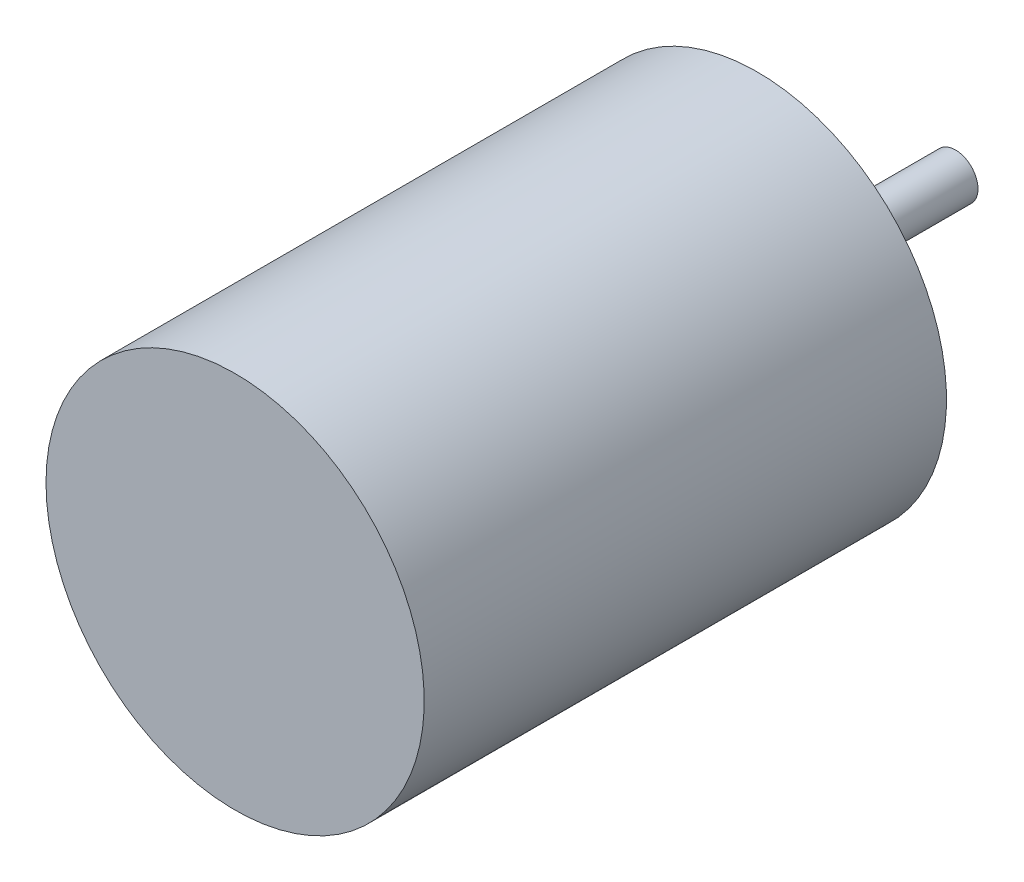
ISO-10303-21;
HEADER;
FILE_DESCRIPTION(('STEP AP214'),'2;1');
FILE_NAME('part.step','',(''),(''),'','','');
FILE_SCHEMA(('AUTOMOTIVE_DESIGN { 1 0 10303 214 1 1 1 1 }'));
ENDSEC;
DATA;
#1=APPLICATION_CONTEXT('core data for automotive mechanical design processes');
#2=APPLICATION_PROTOCOL_DEFINITION('international standard','automotive_design',2000,#1);
#3=PRODUCT_CONTEXT('',#1,'mechanical');
#4=PRODUCT('Part','Part','',(#3));
#5=PRODUCT_RELATED_PRODUCT_CATEGORY('part','',(#4));
#6=PRODUCT_DEFINITION_FORMATION('','',#4);
#7=PRODUCT_DEFINITION_CONTEXT('part definition',#1,'design');
#8=PRODUCT_DEFINITION('design','',#6,#7);
#9=PRODUCT_DEFINITION_SHAPE('','',#8);
#10=(LENGTH_UNIT() NAMED_UNIT(*) SI_UNIT(.MILLI.,.METRE.));
#11=(NAMED_UNIT(*) PLANE_ANGLE_UNIT() SI_UNIT($,.RADIAN.));
#12=(NAMED_UNIT(*) SI_UNIT($,.STERADIAN.) SOLID_ANGLE_UNIT());
#13=UNCERTAINTY_MEASURE_WITH_UNIT(LENGTH_MEASURE(1.E-05),#10,'distance_accuracy_value','');
#14=(GEOMETRIC_REPRESENTATION_CONTEXT(3) GLOBAL_UNCERTAINTY_ASSIGNED_CONTEXT((#13)) GLOBAL_UNIT_ASSIGNED_CONTEXT((#10,
#11,#12)) REPRESENTATION_CONTEXT('',''));
#15=CARTESIAN_POINT('',(0.,0.,0.));
#16=DIRECTION('',(0.,0.,1.));
#17=DIRECTION('',(1.,0.,0.));
#18=AXIS2_PLACEMENT_3D('',#15,#16,#17);
#19=CARTESIAN_POINT('',(75.7710063810863,-68.5826651294381,0.));
#20=DIRECTION('',(0.,0.,1.));
#21=DIRECTION('',(1.,0.,0.));
#22=AXIS2_PLACEMENT_3D('',#19,#20,#21);
#23=PLANE('',#22);
#24=CARTESIAN_POINT('',(75.7710063810863,-68.5826651294381,0.));
#25=DIRECTION('',(0.,0.,1.));
#26=DIRECTION('',(1.,0.,0.));
#27=AXIS2_PLACEMENT_3D('',#24,#25,#26);
#28=CIRCLE('',#27,21.);
#29=CARTESIAN_POINT('',(54.7710063810863,-68.5826651294381,0.));
#30=VERTEX_POINT('',#29);
#31=EDGE_CURVE('E41',#30,#30,#28,.T.);
#32=ORIENTED_EDGE('',*,*,#31,.F.);
#33=EDGE_LOOP('',(#32));
#34=FACE_BOUND('',#33,.T.);
#35=CARTESIAN_POINT('',(75.7710063810863,-68.5826651294381,0.));
#36=DIRECTION('',(0.,0.,1.));
#37=DIRECTION('',(1.,0.,0.));
#38=AXIS2_PLACEMENT_3D('',#35,#36,#37);
#39=CIRCLE('',#38,2.5);
#40=CARTESIAN_POINT('',(78.2710063810863,-68.5826651294381,0.));
#41=VERTEX_POINT('',#40);
#42=EDGE_CURVE('E10',#41,#41,#39,.F.);
#43=ORIENTED_EDGE('',*,*,#42,.F.);
#44=EDGE_LOOP('',(#43));
#45=FACE_BOUND('',#44,.T.);
#46=ADVANCED_FACE('F30',(#34,#45),#23,.F.);
#47=CARTESIAN_POINT('',(75.7710063810863,-68.5826651294381,58.));
#48=DIRECTION('',(0.,0.,-1.));
#49=DIRECTION('',(-1.,0.,0.));
#50=AXIS2_PLACEMENT_3D('',#47,#48,#49);
#51=CYLINDRICAL_SURFACE('',#50,21.);
#52=CARTESIAN_POINT('',(75.7710063810863,-68.5826651294381,58.));
#53=DIRECTION('',(0.,0.,1.));
#54=DIRECTION('',(1.,0.,0.));
#55=AXIS2_PLACEMENT_3D('',#52,#53,#54);
#56=CIRCLE('',#55,21.);
#57=CARTESIAN_POINT('',(54.7710063810863,-68.5826651294381,58.));
#58=VERTEX_POINT('',#57);
#59=EDGE_CURVE('E37',#58,#58,#56,.T.);
#60=CARTESIAN_POINT('',(54.7710063810863,-68.5826651294381,58.));
#61=CARTESIAN_POINT('',(54.7710063810863,-68.5826651294381,57.3958333333333));
#62=CARTESIAN_POINT('',(54.7710063810863,-68.5826651294381,56.7916666666667));
#63=CARTESIAN_POINT('',(54.7710063810863,-68.5826651294381,55.5833333333333));
#64=CARTESIAN_POINT('',(54.7710063810863,-68.5826651294381,54.9791666666667));
#65=CARTESIAN_POINT('',(54.7710063810863,-68.5826651294381,53.7708333333333));
#66=CARTESIAN_POINT('',(54.7710063810863,-68.5826651294381,53.1666666666667));
#67=CARTESIAN_POINT('',(54.7710063810863,-68.5826651294381,51.9583333333333));
#68=CARTESIAN_POINT('',(54.7710063810863,-68.5826651294381,51.3541666666667));
#69=CARTESIAN_POINT('',(54.7710063810863,-68.5826651294381,50.1458333333333));
#70=CARTESIAN_POINT('',(54.7710063810863,-68.5826651294381,49.5416666666667));
#71=CARTESIAN_POINT('',(54.7710063810863,-68.5826651294381,48.3333333333333));
#72=CARTESIAN_POINT('',(54.7710063810863,-68.5826651294381,47.7291666666667));
#73=CARTESIAN_POINT('',(54.7710063810863,-68.5826651294381,46.5208333333333));
#74=CARTESIAN_POINT('',(54.7710063810863,-68.5826651294381,45.9166666666667));
#75=CARTESIAN_POINT('',(54.7710063810863,-68.5826651294381,44.7083333333333));
#76=CARTESIAN_POINT('',(54.7710063810863,-68.5826651294381,44.1041666666667));
#77=CARTESIAN_POINT('',(54.7710063810863,-68.5826651294381,42.8958333333333));
#78=CARTESIAN_POINT('',(54.7710063810863,-68.5826651294381,42.2916666666667));
#79=CARTESIAN_POINT('',(54.7710063810863,-68.5826651294381,41.0833333333333));
#80=CARTESIAN_POINT('',(54.7710063810863,-68.5826651294381,40.4791666666667));
#81=CARTESIAN_POINT('',(54.7710063810863,-68.5826651294381,39.2708333333333));
#82=CARTESIAN_POINT('',(54.7710063810863,-68.5826651294381,38.6666666666667));
#83=CARTESIAN_POINT('',(54.7710063810863,-68.5826651294381,37.4583333333333));
#84=CARTESIAN_POINT('',(54.7710063810863,-68.5826651294381,36.8541666666667));
#85=CARTESIAN_POINT('',(54.7710063810863,-68.5826651294381,35.6458333333333));
#86=CARTESIAN_POINT('',(54.7710063810863,-68.5826651294381,35.0416666666667));
#87=CARTESIAN_POINT('',(54.7710063810863,-68.5826651294381,33.8333333333333));
#88=CARTESIAN_POINT('',(54.7710063810863,-68.5826651294381,33.2291666666667));
#89=CARTESIAN_POINT('',(54.7710063810863,-68.5826651294381,32.0208333333333));
#90=CARTESIAN_POINT('',(54.7710063810863,-68.5826651294381,31.4166666666667));
#91=CARTESIAN_POINT('',(54.7710063810863,-68.5826651294381,30.2083333333333));
#92=CARTESIAN_POINT('',(54.7710063810863,-68.5826651294381,29.6041666666667));
#93=CARTESIAN_POINT('',(54.7710063810863,-68.5826651294381,28.3958333333333));
#94=CARTESIAN_POINT('',(54.7710063810863,-68.5826651294381,27.7916666666667));
#95=CARTESIAN_POINT('',(54.7710063810863,-68.5826651294381,26.5833333333333));
#96=CARTESIAN_POINT('',(54.7710063810863,-68.5826651294381,25.9791666666667));
#97=CARTESIAN_POINT('',(54.7710063810863,-68.5826651294381,24.7708333333333));
#98=CARTESIAN_POINT('',(54.7710063810863,-68.5826651294381,24.1666666666667));
#99=CARTESIAN_POINT('',(54.7710063810863,-68.5826651294381,22.9583333333333));
#100=CARTESIAN_POINT('',(54.7710063810863,-68.5826651294381,22.3541666666667));
#101=CARTESIAN_POINT('',(54.7710063810863,-68.5826651294381,21.1458333333333));
#102=CARTESIAN_POINT('',(54.7710063810863,-68.5826651294381,20.5416666666667));
#103=CARTESIAN_POINT('',(54.7710063810863,-68.5826651294381,19.3333333333333));
#104=CARTESIAN_POINT('',(54.7710063810863,-68.5826651294381,18.7291666666667));
#105=CARTESIAN_POINT('',(54.7710063810863,-68.5826651294381,17.5208333333333));
#106=CARTESIAN_POINT('',(54.7710063810863,-68.5826651294381,16.9166666666667));
#107=CARTESIAN_POINT('',(54.7710063810863,-68.5826651294381,15.7083333333333));
#108=CARTESIAN_POINT('',(54.7710063810863,-68.5826651294381,15.1041666666667));
#109=CARTESIAN_POINT('',(54.7710063810863,-68.5826651294381,13.8958333333333));
#110=CARTESIAN_POINT('',(54.7710063810863,-68.5826651294381,13.2916666666667));
#111=CARTESIAN_POINT('',(54.7710063810863,-68.5826651294381,12.0833333333333));
#112=CARTESIAN_POINT('',(54.7710063810863,-68.5826651294381,11.4791666666667));
#113=CARTESIAN_POINT('',(54.7710063810863,-68.5826651294381,10.2708333333333));
#114=CARTESIAN_POINT('',(54.7710063810863,-68.5826651294381,9.66666666666667));
#115=CARTESIAN_POINT('',(54.7710063810863,-68.5826651294381,8.45833333333333));
#116=CARTESIAN_POINT('',(54.7710063810863,-68.5826651294381,7.85416666666667));
#117=CARTESIAN_POINT('',(54.7710063810863,-68.5826651294381,6.64583333333333));
#118=CARTESIAN_POINT('',(54.7710063810863,-68.5826651294381,6.04166666666667));
#119=CARTESIAN_POINT('',(54.7710063810863,-68.5826651294381,4.83333333333333));
#120=CARTESIAN_POINT('',(54.7710063810863,-68.5826651294381,4.22916666666667));
#121=CARTESIAN_POINT('',(54.7710063810863,-68.5826651294381,3.02083333333334));
#122=CARTESIAN_POINT('',(54.7710063810863,-68.5826651294381,2.41666666666667));
#123=CARTESIAN_POINT('',(54.7710063810863,-68.5826651294381,1.20833333333333));
#124=CARTESIAN_POINT('',(54.7710063810863,-68.5826651294381,0.604166666666666));
#125=CARTESIAN_POINT('',(54.7710063810863,-68.5826651294381,0.));
#126=B_SPLINE_CURVE_WITH_KNOTS('',3,(#60,#61,#62,#63,#64,#65,#66,#67,#68,#69,#70,#71,#72,#73,
#74,#75,#76,#77,#78,#79,#80,#81,#82,#83,#84,#85,#86,#87,#88,#89,#90,#91,#92,#93,#94,#95,#96,#97,
#98,#99,#100,#101,#102,#103,#104,#105,#106,#107,#108,#109,#110,#111,#112,#113,#114,#115,#116,
#117,#118,#119,#120,#121,#122,#123,#124,#125),.UNSPECIFIED.,.F.,.F.,(4,2,2,2,2,2,2,2,2,2,2,2,2,
2,2,2,2,2,2,2,2,2,2,2,2,2,2,2,2,2,2,2,4),(0.,1.81249999999999,3.625,5.4375,7.24999999999999,
9.06249999999999,10.875,12.6875,14.5,16.3125,18.125,19.9375,21.75,23.5625,25.375,27.1875,29.,
30.8125,32.625,34.4375,36.25,38.0625,39.875,41.6875,43.5,45.3125,47.125,48.9375,50.75,52.5625,
54.375,56.1875,58.),.UNSPECIFIED.);
#127=EDGE_CURVE('BSEAM32',#58,#30,#126,.T.);
#128=ORIENTED_EDGE('',*,*,#59,.F.);
#129=ORIENTED_EDGE('',*,*,#31,.T.);
#130=ORIENTED_EDGE('',*,*,#127,.T.);
#131=ORIENTED_EDGE('',*,*,#127,.F.);
#132=EDGE_LOOP('',(#128,#130,#129,#131));
#133=FACE_BOUND('',#132,.T.);
#134=ADVANCED_FACE('F32',(#133),#51,.T.);
#135=CARTESIAN_POINT('',(75.7710063810863,-68.5826651294381,58.));
#136=DIRECTION('',(0.,0.,1.));
#137=DIRECTION('',(1.,0.,0.));
#138=AXIS2_PLACEMENT_3D('',#135,#136,#137);
#139=PLANE('',#138);
#140=ORIENTED_EDGE('',*,*,#59,.T.);
#141=EDGE_LOOP('',(#140));
#142=FACE_BOUND('',#141,.T.);
#143=ADVANCED_FACE('F55',(#142),#139,.T.);
#144=CARTESIAN_POINT('',(75.7710063810863,-68.5826651294381,-22.));
#145=DIRECTION('',(0.,0.,1.));
#146=DIRECTION('',(1.,0.,0.));
#147=AXIS2_PLACEMENT_3D('',#144,#145,#146);
#148=CYLINDRICAL_SURFACE('',#147,2.5);
#149=CARTESIAN_POINT('',(75.7710063810863,-68.5826651294381,-22.));
#150=DIRECTION('',(0.,0.,-1.));
#151=DIRECTION('',(-1.,0.,0.));
#152=AXIS2_PLACEMENT_3D('',#149,#150,#151);
#153=CIRCLE('',#152,2.5);
#154=CARTESIAN_POINT('',(73.2710063810863,-68.5826651294381,-22.));
#155=VERTEX_POINT('',#154);
#156=EDGE_CURVE('E46',#155,#155,#153,.T.);
#157=ORIENTED_EDGE('',*,*,#156,.F.);
#158=EDGE_LOOP('',(#157));
#159=FACE_BOUND('',#158,.T.);
#160=ORIENTED_EDGE('',*,*,#42,.T.);
#161=EDGE_LOOP('',(#160));
#162=FACE_BOUND('',#161,.T.);
#163=ADVANCED_FACE('F53',(#159,#162),#148,.T.);
#164=CARTESIAN_POINT('',(75.7710063810863,-68.5826651294381,-22.));
#165=DIRECTION('',(0.,0.,-1.));
#166=DIRECTION('',(-1.,0.,0.));
#167=AXIS2_PLACEMENT_3D('',#164,#165,#166);
#168=PLANE('',#167);
#169=ORIENTED_EDGE('',*,*,#156,.T.);
#170=EDGE_LOOP('',(#169));
#171=FACE_BOUND('',#170,.T.);
#172=ADVANCED_FACE('F51',(#171),#168,.T.);
#173=CLOSED_SHELL('',(#46,#134,#143,#163,#172));
#174=MANIFOLD_SOLID_BREP('B2',#173);
#175=ADVANCED_BREP_SHAPE_REPRESENTATION('',(#18,#174),#14);
#176=SHAPE_DEFINITION_REPRESENTATION(#9,#175);
ENDSEC;
END-ISO-10303-21;
